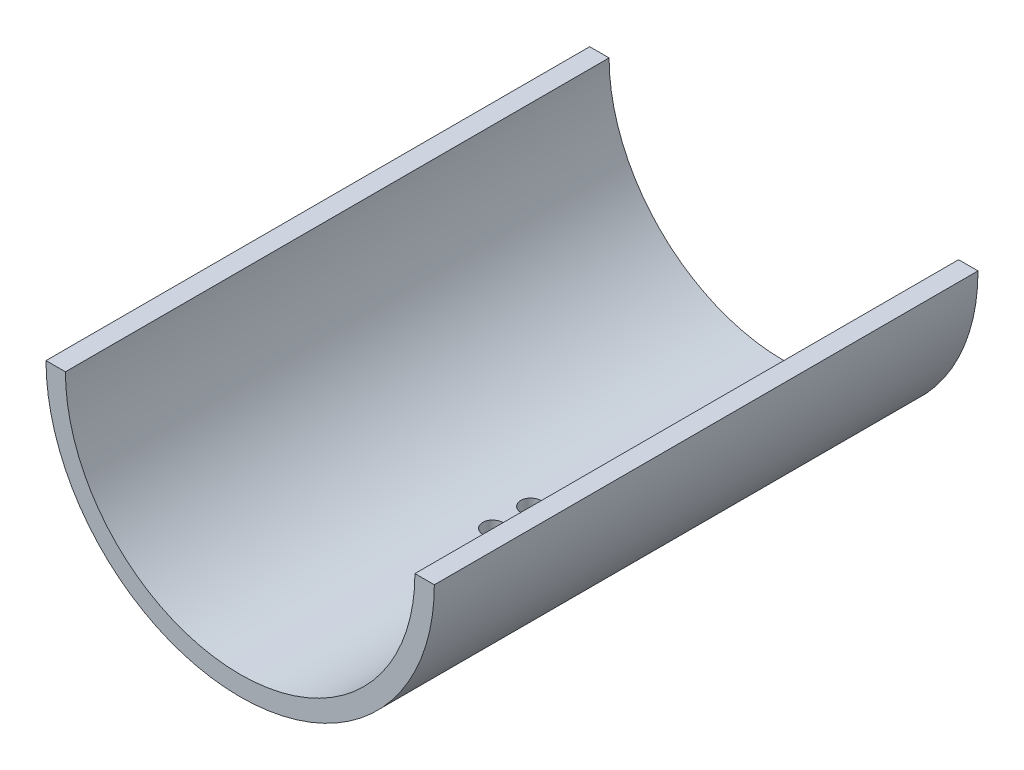
ISO-10303-21;
HEADER;
FILE_DESCRIPTION(('STEP AP214'),'2;1');
FILE_NAME('part.step','',(''),(''),'','','');
FILE_SCHEMA(('AUTOMOTIVE_DESIGN { 1 0 10303 214 1 1 1 1 }'));
ENDSEC;
DATA;
#1=APPLICATION_CONTEXT('core data for automotive mechanical design processes');
#2=APPLICATION_PROTOCOL_DEFINITION('international standard','automotive_design',2000,#1);
#3=PRODUCT_CONTEXT('',#1,'mechanical');
#4=PRODUCT('Part','Part','',(#3));
#5=PRODUCT_RELATED_PRODUCT_CATEGORY('part','',(#4));
#6=PRODUCT_DEFINITION_FORMATION('','',#4);
#7=PRODUCT_DEFINITION_CONTEXT('part definition',#1,'design');
#8=PRODUCT_DEFINITION('design','',#6,#7);
#9=PRODUCT_DEFINITION_SHAPE('','',#8);
#10=(LENGTH_UNIT() NAMED_UNIT(*) SI_UNIT(.MILLI.,.METRE.));
#11=(NAMED_UNIT(*) PLANE_ANGLE_UNIT() SI_UNIT($,.RADIAN.));
#12=(NAMED_UNIT(*) SI_UNIT($,.STERADIAN.) SOLID_ANGLE_UNIT());
#13=UNCERTAINTY_MEASURE_WITH_UNIT(LENGTH_MEASURE(1.E-05),#10,'distance_accuracy_value','');
#14=(GEOMETRIC_REPRESENTATION_CONTEXT(3) GLOBAL_UNCERTAINTY_ASSIGNED_CONTEXT((#13)) GLOBAL_UNIT_ASSIGNED_CONTEXT((#10,
#11,#12)) REPRESENTATION_CONTEXT('',''));
#15=CARTESIAN_POINT('',(0.,0.,0.));
#16=DIRECTION('',(0.,0.,1.));
#17=DIRECTION('',(1.,0.,0.));
#18=AXIS2_PLACEMENT_3D('',#15,#16,#17);
#19=CARTESIAN_POINT('',(63.5,4.43418130033078E-13,-149.431299240392));
#20=DIRECTION('',(0.,0.,1.));
#21=DIRECTION('',(1.,0.,0.));
#22=AXIS2_PLACEMENT_3D('',#19,#20,#21);
#23=PLANE('',#22);
#24=CARTESIAN_POINT('',(0.,0.,-149.431299240392));
#25=DIRECTION('',(0.,0.,-1.));
#26=DIRECTION('',(-1.,0.,0.));
#27=AXIS2_PLACEMENT_3D('',#24,#25,#26);
#28=CIRCLE('',#27,63.5);
#29=CARTESIAN_POINT('',(63.5,4.43418130033078E-13,-149.431299240392));
#30=VERTEX_POINT('',#29);
#31=CARTESIAN_POINT('',(-63.5,0.,-149.431299240392));
#32=VERTEX_POINT('',#31);
#33=EDGE_CURVE('E11',#30,#32,#28,.T.);
#34=ORIENTED_EDGE('',*,*,#33,.T.);
#35=DIRECTION('',(1.,0.,0.));
#36=VECTOR('',#35,1.);
#37=CARTESIAN_POINT('',(-63.5,0.,-149.431299240392));
#38=LINE('',#37,#36);
#39=CARTESIAN_POINT('',(-57.15,0.,-149.431299240392));
#40=VERTEX_POINT('',#39);
#41=EDGE_CURVE('E100',#32,#40,#38,.T.);
#42=ORIENTED_EDGE('',*,*,#41,.T.);
#43=CARTESIAN_POINT('',(0.,0.,-149.431299240392));
#44=DIRECTION('',(0.,0.,-1.));
#45=DIRECTION('',(-1.,0.,0.));
#46=AXIS2_PLACEMENT_3D('',#43,#44,#45);
#47=CIRCLE('',#46,57.15);
#48=CARTESIAN_POINT('',(57.15,3.9907631702977E-13,-149.431299240392));
#49=VERTEX_POINT('',#48);
#50=EDGE_CURVE('E82',#49,#40,#47,.T.);
#51=ORIENTED_EDGE('',*,*,#50,.F.);
#52=DIRECTION('',(-1.,0.,0.));
#53=VECTOR('',#52,1.);
#54=CARTESIAN_POINT('',(63.5,4.43418130033078E-13,-149.431299240392));
#55=LINE('',#54,#53);
#56=EDGE_CURVE('E116',#30,#49,#55,.T.);
#57=ORIENTED_EDGE('',*,*,#56,.F.);
#58=EDGE_LOOP('',(#34,#42,#51,#57));
#59=FACE_BOUND('',#58,.T.);
#60=ADVANCED_FACE('F35',(#59),#23,.F.);
#61=CARTESIAN_POINT('',(0.,0.,0.));
#62=DIRECTION('',(0.,0.,-1.));
#63=DIRECTION('',(-1.,0.,0.));
#64=AXIS2_PLACEMENT_3D('',#61,#62,#63);
#65=CYLINDRICAL_SURFACE('',#64,63.5);
#66=CARTESIAN_POINT('',(0.,-63.5,-50.9807992913919));
#67=CARTESIAN_POINT('',(0.186769612973574,-63.4999988348745,-50.9808075298809));
#68=CARTESIAN_POINT('',(0.373671384199386,-63.499167171897,-50.9965769279547));
#69=CARTESIAN_POINT('',(0.742318125547375,-63.4959294564745,-51.0592600732091));
#70=CARTESIAN_POINT('',(0.924056770398998,-63.4935215530255,-51.10621043763));
#71=CARTESIAN_POINT('',(1.2769837629213,-63.4874038671894,-51.2299068324632));
#72=CARTESIAN_POINT('',(1.44817746831194,-63.4836947524497,-51.3066375847931));
#73=CARTESIAN_POINT('',(1.77520888061647,-63.4753922812404,-51.4876929455275));
#74=CARTESIAN_POINT('',(1.93105018177016,-63.4707991324845,-51.5920110741201));
#75=CARTESIAN_POINT('',(2.22316985270653,-63.4612395969032,-51.8254067427574));
#76=CARTESIAN_POINT('',(2.35942929526198,-63.4562728559437,-51.9545079596415));
#77=CARTESIAN_POINT('',(2.60835592417208,-63.4465289652106,-52.2337574650064));
#78=CARTESIAN_POINT('',(2.72102214298066,-63.4417518232187,-52.383906616231));
#79=CARTESIAN_POINT('',(2.91961776346526,-63.4329232758394,-52.701090938846));
#80=CARTESIAN_POINT('',(3.00553216500733,-63.4288722781499,-52.868135514457));
#81=CARTESIAN_POINT('',(3.14808918437568,-63.4219572198435,-53.2143027640495));
#82=CARTESIAN_POINT('',(3.20473204049849,-63.419093149564,-53.3934253396918));
#83=CARTESIAN_POINT('',(3.28708748951324,-63.4148781639503,-53.7584878976584));
#84=CARTESIAN_POINT('',(3.3128287160745,-63.4135258478939,-53.9444214040043));
#85=CARTESIAN_POINT('',(3.33273856154113,-63.4124826662,-54.3179748731268));
#86=CARTESIAN_POINT('',(3.32690744854904,-63.412791786454,-54.5055948215691));
#87=CARTESIAN_POINT('',(3.28386197166952,-63.4150353166452,-54.8770006227596));
#88=CARTESIAN_POINT('',(3.24667855317205,-63.4169681239618,-55.0607900730632));
#89=CARTESIAN_POINT('',(3.14203192930411,-63.4222386632954,-55.4195149332989));
#90=CARTESIAN_POINT('',(3.07456858660398,-63.4255764016843,-55.5944503030707));
#91=CARTESIAN_POINT('',(2.91124184674428,-63.4332824668411,-55.9306008775589));
#92=CARTESIAN_POINT('',(2.8153643536022,-63.437651304908,-56.091809221212));
#93=CARTESIAN_POINT('',(2.59794118134746,-63.4469266516682,-56.3958545945505));
#94=CARTESIAN_POINT('',(2.47639530228522,-63.4518331645497,-56.5386914811134));
#95=CARTESIAN_POINT('',(2.21091102916137,-63.4616379852014,-56.8021194258162));
#96=CARTESIAN_POINT('',(2.06694584035849,-63.4665362759707,-56.9226834823425));
#97=CARTESIAN_POINT('',(1.76080371764046,-63.4757668910125,-57.1379352926375));
#98=CARTESIAN_POINT('',(1.59862677895295,-63.4800992151367,-57.2326230396252));
#99=CARTESIAN_POINT('',(1.26064886649794,-63.4877098656738,-57.3934318579842));
#100=CARTESIAN_POINT('',(1.0848474368834,-63.4909881568022,-57.4595519730549));
#101=CARTESIAN_POINT('',(0.724617959922059,-63.4961207754913,-57.5613309033625));
#102=CARTESIAN_POINT('',(0.540189983490808,-63.4979751147557,-57.5969899689616));
#103=CARTESIAN_POINT('',(0.168177031972474,-63.5000493432645,-57.6368012597076));
#104=CARTESIAN_POINT('',(-0.0194039362495373,-63.5002711698317,-57.6409908302105));
#105=CARTESIAN_POINT('',(-0.39260418007826,-63.4990605186156,-57.6178416839737));
#106=CARTESIAN_POINT('',(-0.578223462819968,-63.4976280468513,-57.5905030819473));
#107=CARTESIAN_POINT('',(-0.942126540985848,-63.493271374542,-57.505104545192));
#108=CARTESIAN_POINT('',(-1.12041435216575,-63.4903480027113,-57.4470616767101));
#109=CARTESIAN_POINT('',(-1.46471729689384,-63.4833386192235,-57.3019195383311));
#110=CARTESIAN_POINT('',(-1.63073235279255,-63.4792526002111,-57.2148200846128));
#111=CARTESIAN_POINT('',(-1.94594862558864,-63.4703726582839,-57.0139416913865));
#112=CARTESIAN_POINT('',(-2.09513388036065,-63.4655780731234,-56.9001377339812));
#113=CARTESIAN_POINT('',(-2.37229520082514,-63.4558231066146,-56.6491173380283));
#114=CARTESIAN_POINT('',(-2.50027111776843,-63.4508627241038,-56.5119007352927));
#115=CARTESIAN_POINT('',(-2.73150686182854,-63.4413297042126,-56.2177893864331));
#116=CARTESIAN_POINT('',(-2.83474251486356,-63.4367574488707,-56.0608756201419));
#117=CARTESIAN_POINT('',(-3.01340200607156,-63.4285222997772,-55.7319201631785));
#118=CARTESIAN_POINT('',(-3.08882597416744,-63.4248594017776,-55.559878543181));
#119=CARTESIAN_POINT('',(-3.20967898520769,-63.4188587526931,-55.2056403476141));
#120=CARTESIAN_POINT('',(-3.25512340475641,-63.4165203223717,-55.0234490299406));
#121=CARTESIAN_POINT('',(-3.31477759721792,-63.4134304025298,-54.6540096992474));
#122=CARTESIAN_POINT('',(-3.3289875705976,-63.4126789028241,-54.4667617186899));
#123=CARTESIAN_POINT('',(-3.32576760874424,-63.4128478396504,-54.0927649206231));
#124=CARTESIAN_POINT('',(-3.30837569804744,-63.4137662668665,-53.906015773635));
#125=CARTESIAN_POINT('',(-3.24252430425143,-63.4171672990711,-53.5380927062273));
#126=CARTESIAN_POINT('',(-3.19406476239714,-63.4196499070177,-53.3569187963524));
#127=CARTESIAN_POINT('',(-3.06746162862366,-63.4258990383602,-53.0052815614424));
#128=CARTESIAN_POINT('',(-2.98931788161838,-63.4296655684641,-52.8348182923709));
#129=CARTESIAN_POINT('',(-2.80557079140465,-63.4380579286002,-52.509427990118));
#130=CARTESIAN_POINT('',(-2.69996826770233,-63.4426837329862,-52.3545004934634));
#131=CARTESIAN_POINT('',(-2.46416401229021,-63.4522796726816,-52.0643889118328));
#132=CARTESIAN_POINT('',(-2.33393552985312,-63.4572501786806,-51.9292265832082));
#133=CARTESIAN_POINT('',(-2.05259829010835,-63.4669725726373,-51.6826396681636));
#134=CARTESIAN_POINT('',(-1.90148440888299,-63.4717244065646,-51.571220923977));
#135=CARTESIAN_POINT('',(-1.58253805541253,-63.4804775729998,-51.3752266614078));
#136=CARTESIAN_POINT('',(-1.41468890871421,-63.4844781453014,-51.2906782740593));
#137=CARTESIAN_POINT('',(-1.06728171777258,-63.4912668696877,-51.1510642902));
#138=CARTESIAN_POINT('',(-0.88773776521848,-63.4940564509796,-51.0959639213901));
#139=CARTESIAN_POINT('',(-0.589234376711043,-63.4973722175876,-51.0312399840445));
#140=CARTESIAN_POINT('',(-0.47220772872193,-63.4983532968073,-51.0123489273422));
#141=CARTESIAN_POINT('',(-0.236805098713705,-63.4996675571064,-50.9871259749589));
#142=CARTESIAN_POINT('',(-0.118429117967398,-63.5000007387968,-50.980794067432));
#143=CARTESIAN_POINT('',(0.,-63.5,-50.9807992913919));
#144=B_SPLINE_CURVE_WITH_KNOTS('',3,(#66,#67,#68,#69,#70,#71,#72,#73,#74,#75,#76,#77,#78,#79,
#80,#81,#82,#83,#84,#85,#86,#87,#88,#89,#90,#91,#92,#93,#94,#95,#96,#97,#98,#99,#100,#101,#102,
#103,#104,#105,#106,#107,#108,#109,#110,#111,#112,#113,#114,#115,#116,#117,#118,#119,#120,#121,
#122,#123,#124,#125,#126,#127,#128,#129,#130,#131,#132,#133,#134,#135,#136,#137,#138,#139,#140,
#141,#142,#143),.UNSPECIFIED.,.T.,.F.,(4,2,2,2,2,2,2,2,2,2,2,2,2,2,2,2,2,2,2,2,2,2,2,2,2,2,2,2,
2,2,2,2,2,2,2,2,2,2,4),(0.,0.559876523927777,1.12041170192468,1.68065969069416,2.24077620330726,
2.80143051772467,3.36210781978875,3.92309893801324,4.48408548919694,5.04455182403726,
5.60501339957823,6.16492243434914,6.72483400852167,7.28502381565576,7.8452179866736,
8.40608689378072,8.96695594786367,9.52784377556356,10.0887269932286,10.6489444964421,
11.2091599613443,11.7690643702796,12.3289723214159,12.8894069268809,13.4498454627216,
14.0108293988221,14.5718107142401,15.1325040764159,15.6931938399755,16.2532094079097,
16.8132260349477,17.3732455878512,17.9332484289108,18.4938631221405,19.0546155986857,
19.615932482031,20.1765850882347,20.5315986495085,20.8866118759309),.UNSPECIFIED.);
#145=CARTESIAN_POINT('',(0.,-63.5,-50.9807992913919));
#146=VERTEX_POINT('',#145);
#147=EDGE_CURVE('E126',#146,#146,#144,.T.);
#148=ORIENTED_EDGE('',*,*,#147,.T.);
#149=EDGE_LOOP('',(#148));
#150=FACE_BOUND('',#149,.T.);
#151=CARTESIAN_POINT('',(0.,-63.5,-63.4267992913919));
#152=CARTESIAN_POINT('',(0.186769612973574,-63.4999988348745,-63.4268075298809));
#153=CARTESIAN_POINT('',(0.373671384199388,-63.499167171897,-63.4425769279547));
#154=CARTESIAN_POINT('',(0.742318125547376,-63.4959294564745,-63.5052600732091));
#155=CARTESIAN_POINT('',(0.924056770398999,-63.4935215530255,-63.55221043763));
#156=CARTESIAN_POINT('',(1.2769837629213,-63.4874038671894,-63.6759068324632));
#157=CARTESIAN_POINT('',(1.44817746831194,-63.4836947524497,-63.7526375847931));
#158=CARTESIAN_POINT('',(1.77520888061647,-63.4753922812404,-63.9336929455275));
#159=CARTESIAN_POINT('',(1.93105018177016,-63.4707991324845,-64.0380110741201));
#160=CARTESIAN_POINT('',(2.22316985270653,-63.4612395969032,-64.2714067427574));
#161=CARTESIAN_POINT('',(2.35942929526198,-63.4562728559437,-64.4005079596415));
#162=CARTESIAN_POINT('',(2.60835592417208,-63.4465289652106,-64.6797574650065));
#163=CARTESIAN_POINT('',(2.72102214298066,-63.4417518232187,-64.829906616231));
#164=CARTESIAN_POINT('',(2.91961776346526,-63.4329232758394,-65.147090938846));
#165=CARTESIAN_POINT('',(3.00553216500733,-63.4288722781499,-65.314135514457));
#166=CARTESIAN_POINT('',(3.14808918437568,-63.4219572198435,-65.6603027640495));
#167=CARTESIAN_POINT('',(3.20473204049849,-63.419093149564,-65.8394253396918));
#168=CARTESIAN_POINT('',(3.28708748951324,-63.4148781639503,-66.2044878976584));
#169=CARTESIAN_POINT('',(3.3128287160745,-63.4135258478939,-66.3904214040043));
#170=CARTESIAN_POINT('',(3.33273856154112,-63.4124826662,-66.7639748731268));
#171=CARTESIAN_POINT('',(3.32690744854903,-63.412791786454,-66.9515948215691));
#172=CARTESIAN_POINT('',(3.28386197166952,-63.4150353166452,-67.3230006227596));
#173=CARTESIAN_POINT('',(3.24667855317205,-63.4169681239618,-67.5067900730632));
#174=CARTESIAN_POINT('',(3.1420319293041,-63.4222386632954,-67.8655149332989));
#175=CARTESIAN_POINT('',(3.07456858660398,-63.4255764016843,-68.0404503030707));
#176=CARTESIAN_POINT('',(2.91124184674428,-63.4332824668411,-68.3766008775589));
#177=CARTESIAN_POINT('',(2.81536435360219,-63.437651304908,-68.537809221212));
#178=CARTESIAN_POINT('',(2.59794118134745,-63.4469266516682,-68.8418545945505));
#179=CARTESIAN_POINT('',(2.4763953022852,-63.4518331645497,-68.9846914811134));
#180=CARTESIAN_POINT('',(2.21091102916136,-63.4616379852014,-69.2481194258162));
#181=CARTESIAN_POINT('',(2.06694584035848,-63.4665362759707,-69.3686834823425));
#182=CARTESIAN_POINT('',(1.76080371764046,-63.4757668910125,-69.5839352926374));
#183=CARTESIAN_POINT('',(1.59862677895294,-63.4800992151367,-69.6786230396252));
#184=CARTESIAN_POINT('',(1.26064886649794,-63.4877098656738,-69.8394318579842));
#185=CARTESIAN_POINT('',(1.0848474368834,-63.4909881568022,-69.9055519730549));
#186=CARTESIAN_POINT('',(0.724617959922055,-63.4961207754913,-70.0073309033625));
#187=CARTESIAN_POINT('',(0.540189983490803,-63.4979751147557,-70.0429899689615));
#188=CARTESIAN_POINT('',(0.168177031972469,-63.5000493432645,-70.0828012597076));
#189=CARTESIAN_POINT('',(-0.0194039362495408,-63.5002711698317,-70.0869908302105));
#190=CARTESIAN_POINT('',(-0.392604180078263,-63.4990605186156,-70.0638416839737));
#191=CARTESIAN_POINT('',(-0.57822346281997,-63.4976280468513,-70.0365030819473));
#192=CARTESIAN_POINT('',(-0.94212654098585,-63.493271374542,-69.951104545192));
#193=CARTESIAN_POINT('',(-1.12041435216575,-63.4903480027113,-69.8930616767101));
#194=CARTESIAN_POINT('',(-1.46471729689384,-63.4833386192235,-69.7479195383311));
#195=CARTESIAN_POINT('',(-1.63073235279255,-63.4792526002111,-69.6608200846128));
#196=CARTESIAN_POINT('',(-1.94594862558865,-63.4703726582839,-69.4599416913865));
#197=CARTESIAN_POINT('',(-2.09513388036066,-63.4655780731234,-69.3461377339812));
#198=CARTESIAN_POINT('',(-2.37229520082515,-63.4558231066146,-69.0951173380283));
#199=CARTESIAN_POINT('',(-2.50027111776843,-63.4508627241038,-68.9579007352927));
#200=CARTESIAN_POINT('',(-2.73150686182854,-63.4413297042126,-68.6637893864331));
#201=CARTESIAN_POINT('',(-2.83474251486356,-63.4367574488707,-68.5068756201419));
#202=CARTESIAN_POINT('',(-3.01340200607155,-63.4285222997772,-68.1779201631785));
#203=CARTESIAN_POINT('',(-3.08882597416744,-63.4248594017776,-68.005878543181));
#204=CARTESIAN_POINT('',(-3.20967898520769,-63.4188587526931,-67.6516403476141));
#205=CARTESIAN_POINT('',(-3.25512340475641,-63.4165203223717,-67.4694490299406));
#206=CARTESIAN_POINT('',(-3.31477759721792,-63.4134304025298,-67.1000096992474));
#207=CARTESIAN_POINT('',(-3.3289875705976,-63.4126789028241,-66.9127617186899));
#208=CARTESIAN_POINT('',(-3.32576760874423,-63.4128478396504,-66.5387649206231));
#209=CARTESIAN_POINT('',(-3.30837569804744,-63.4137662668665,-66.3520157736349));
#210=CARTESIAN_POINT('',(-3.24252430425142,-63.4171672990711,-65.9840927062273));
#211=CARTESIAN_POINT('',(-3.19406476239713,-63.4196499070177,-65.8029187963524));
#212=CARTESIAN_POINT('',(-3.06746162862366,-63.4258990383602,-65.4512815614424));
#213=CARTESIAN_POINT('',(-2.98931788161837,-63.4296655684641,-65.2808182923708));
#214=CARTESIAN_POINT('',(-2.80557079140464,-63.4380579286002,-64.955427990118));
#215=CARTESIAN_POINT('',(-2.69996826770231,-63.4426837329862,-64.8005004934634));
#216=CARTESIAN_POINT('',(-2.4641640122902,-63.4522796726816,-64.5103889118328));
#217=CARTESIAN_POINT('',(-2.33393552985311,-63.4572501786806,-64.3752265832082));
#218=CARTESIAN_POINT('',(-2.05259829010834,-63.4669725726373,-64.1286396681636));
#219=CARTESIAN_POINT('',(-1.90148440888299,-63.4717244065646,-64.017220923977));
#220=CARTESIAN_POINT('',(-1.58253805541253,-63.4804775729998,-63.8212266614078));
#221=CARTESIAN_POINT('',(-1.4146889087142,-63.4844781453014,-63.7366782740593));
#222=CARTESIAN_POINT('',(-1.06728171777256,-63.4912668696877,-63.5970642902));
#223=CARTESIAN_POINT('',(-0.887737765218469,-63.4940564509796,-63.5419639213901));
#224=CARTESIAN_POINT('',(-0.589234376711034,-63.4973722175876,-63.4772399840445));
#225=CARTESIAN_POINT('',(-0.472207728721921,-63.4983532968073,-63.4583489273422));
#226=CARTESIAN_POINT('',(-0.236805098713698,-63.4996675571064,-63.4331259749589));
#227=CARTESIAN_POINT('',(-0.118429117967395,-63.5000007387968,-63.426794067432));
#228=CARTESIAN_POINT('',(0.,-63.5,-63.4267992913919));
#229=B_SPLINE_CURVE_WITH_KNOTS('',3,(#151,#152,#153,#154,#155,#156,#157,#158,#159,#160,#161,
#162,#163,#164,#165,#166,#167,#168,#169,#170,#171,#172,#173,#174,#175,#176,#177,#178,#179,#180,
#181,#182,#183,#184,#185,#186,#187,#188,#189,#190,#191,#192,#193,#194,#195,#196,#197,#198,#199,
#200,#201,#202,#203,#204,#205,#206,#207,#208,#209,#210,#211,#212,#213,#214,#215,#216,#217,#218,
#219,#220,#221,#222,#223,#224,#225,#226,#227,#228),.UNSPECIFIED.,.T.,.F.,(4,2,2,2,2,2,2,2,2,2,2,
2,2,2,2,2,2,2,2,2,2,2,2,2,2,2,2,2,2,2,2,2,2,2,2,2,2,2,4),(0.,0.55987652392778,1.12041170192468,
1.68065969069416,2.24077620330726,2.80143051772468,3.36210781978875,3.92309893801325,
4.48408548919694,5.04455182403726,5.60501339957822,6.16492243434913,6.72483400852166,
7.28502381565576,7.84521798667359,8.40608689378071,8.96695594786365,9.52784377556355,
10.0887269932286,10.6489444964421,11.2091599613443,11.7690643702796,12.3289723214159,
12.8894069268809,13.4498454627216,14.010829398822,14.5718107142401,15.1325040764159,
15.6931938399755,16.2532094079097,16.8132260349477,17.3732455878512,17.9332484289108,
18.4938631221404,19.0546155986857,19.615932482031,20.1765850882347,20.5315986495085,
20.8866118759309),.UNSPECIFIED.);
#230=CARTESIAN_POINT('',(0.,-63.5,-63.4267992913919));
#231=VERTEX_POINT('',#230);
#232=EDGE_CURVE('E103',#231,#231,#229,.T.);
#233=ORIENTED_EDGE('',*,*,#232,.T.);
#234=EDGE_LOOP('',(#233));
#235=FACE_BOUND('',#234,.T.);
#236=CARTESIAN_POINT('',(0.,0.,28.3687007596081));
#237=DIRECTION('',(0.,0.,-1.));
#238=DIRECTION('',(-1.,0.,0.));
#239=AXIS2_PLACEMENT_3D('',#236,#237,#238);
#240=CIRCLE('',#239,63.5);
#241=CARTESIAN_POINT('',(63.5,4.43418130033078E-13,28.3687007596081));
#242=VERTEX_POINT('',#241);
#243=CARTESIAN_POINT('',(-63.5,0.,28.3687007596081));
#244=VERTEX_POINT('',#243);
#245=EDGE_CURVE('E49',#242,#244,#240,.T.);
#246=ORIENTED_EDGE('',*,*,#245,.T.);
#247=DIRECTION('',(0.,0.,-1.));
#248=VECTOR('',#247,1.);
#249=CARTESIAN_POINT('',(-63.5,0.,28.3687007596081));
#250=LINE('',#249,#248);
#251=EDGE_CURVE('E114',#244,#32,#250,.T.);
#252=ORIENTED_EDGE('',*,*,#251,.T.);
#253=ORIENTED_EDGE('',*,*,#33,.F.);
#254=DIRECTION('',(0.,0.,-1.));
#255=VECTOR('',#254,1.);
#256=CARTESIAN_POINT('',(63.5,4.43418130033078E-13,28.3687007596081));
#257=LINE('',#256,#255);
#258=EDGE_CURVE('E94',#242,#30,#257,.T.);
#259=ORIENTED_EDGE('',*,*,#258,.F.);
#260=EDGE_LOOP('',(#246,#252,#253,#259));
#261=FACE_BOUND('',#260,.T.);
#262=ADVANCED_FACE('F37',(#150,#235,#261),#65,.T.);
#263=CARTESIAN_POINT('',(63.5,4.43418130033078E-13,28.3687007596081));
#264=DIRECTION('',(0.,0.,-1.));
#265=DIRECTION('',(-1.,0.,0.));
#266=AXIS2_PLACEMENT_3D('',#263,#264,#265);
#267=PLANE('',#266);
#268=CARTESIAN_POINT('',(0.,0.,28.3687007596081));
#269=DIRECTION('',(0.,0.,-1.));
#270=DIRECTION('',(-1.,0.,0.));
#271=AXIS2_PLACEMENT_3D('',#268,#269,#270);
#272=CIRCLE('',#271,57.15);
#273=CARTESIAN_POINT('',(57.15,3.9907631702977E-13,28.3687007596081));
#274=VERTEX_POINT('',#273);
#275=CARTESIAN_POINT('',(-57.15,0.,28.3687007596081));
#276=VERTEX_POINT('',#275);
#277=EDGE_CURVE('E93',#274,#276,#272,.T.);
#278=ORIENTED_EDGE('',*,*,#277,.T.);
#279=DIRECTION('',(-1.,0.,0.));
#280=VECTOR('',#279,1.);
#281=CARTESIAN_POINT('',(-63.5,0.,28.3687007596081));
#282=LINE('',#281,#280);
#283=EDGE_CURVE('E101',#276,#244,#282,.T.);
#284=ORIENTED_EDGE('',*,*,#283,.T.);
#285=ORIENTED_EDGE('',*,*,#245,.F.);
#286=DIRECTION('',(1.,0.,0.));
#287=VECTOR('',#286,1.);
#288=CARTESIAN_POINT('',(63.5,4.43418130033078E-13,28.3687007596081));
#289=LINE('',#288,#287);
#290=EDGE_CURVE('E119',#274,#242,#289,.T.);
#291=ORIENTED_EDGE('',*,*,#290,.F.);
#292=EDGE_LOOP('',(#278,#284,#285,#291));
#293=FACE_BOUND('',#292,.T.);
#294=ADVANCED_FACE('F146',(#293),#267,.F.);
#295=CARTESIAN_POINT('',(0.,0.,0.));
#296=DIRECTION('',(0.,0.,-1.));
#297=DIRECTION('',(-1.,0.,0.));
#298=AXIS2_PLACEMENT_3D('',#295,#296,#297);
#299=CYLINDRICAL_SURFACE('',#298,57.15);
#300=CARTESIAN_POINT('',(0.,-57.15,-50.9807992913919));
#301=CARTESIAN_POINT('',(-0.186737397736102,-57.1499987091822,-50.9808075171684));
#302=CARTESIAN_POINT('',(-0.373606163322599,-57.1490749611724,-50.9965714977295));
#303=CARTESIAN_POINT('',(-0.742185594533203,-57.145478754157,-51.0592318688822));
#304=CARTESIAN_POINT('',(-0.923889970153505,-57.1428042506668,-51.1061646584917));
#305=CARTESIAN_POINT('',(-1.27674825866674,-57.1360091461716,-51.2298116354871));
#306=CARTESIAN_POINT('',(-1.44790761410133,-57.1318892986204,-51.3065103082116));
#307=CARTESIAN_POINT('',(-1.77487710419956,-57.1226671034869,-51.48748718153));
#308=CARTESIAN_POINT('',(-1.93069078229395,-57.1175649835264,-51.591758994693));
#309=CARTESIAN_POINT('',(-2.22279678426903,-57.1069443879398,-51.8250736529826));
#310=CARTESIAN_POINT('',(-2.35906624968253,-57.1014254361244,-51.9541450971742));
#311=CARTESIAN_POINT('',(-2.60802036170871,-57.090597274046,-52.2333367405944));
#312=CARTESIAN_POINT('',(-2.72070403099732,-57.0852880724817,-52.3834578116257));
#313=CARTESIAN_POINT('',(-2.91935616560733,-57.0754745433863,-52.700614004431));
#314=CARTESIAN_POINT('',(-3.00530597189818,-57.0709707789417,-52.8676608322918));
#315=CARTESIAN_POINT('',(-3.14793110050543,-57.0632820708122,-53.2138445193958));
#316=CARTESIAN_POINT('',(-3.20460670356321,-57.06009711448,-53.3929812626774));
#317=CARTESIAN_POINT('',(-3.28701205004692,-57.0554096579048,-53.7580423663256));
#318=CARTESIAN_POINT('',(-3.31277714301331,-57.0539052359235,-53.9439587221589));
#319=CARTESIAN_POINT('',(-3.33273919742333,-57.052742741432,-54.3174831574174));
#320=CARTESIAN_POINT('',(-3.32693647657659,-57.0530846503396,-54.5050912197978));
#321=CARTESIAN_POINT('',(-3.28395699083705,-57.0555744759021,-54.8764329144889));
#322=CARTESIAN_POINT('',(-3.24681845596538,-57.0577201918817,-55.0601709883865));
#323=CARTESIAN_POINT('',(-3.1422808476315,-57.0635723443425,-55.4188006373829));
#324=CARTESIAN_POINT('',(-3.07488161243206,-57.0672787891655,-55.5936921651931));
#325=CARTESIAN_POINT('',(-2.91169232378512,-57.0758372208145,-55.9297871459696));
#326=CARTESIAN_POINT('',(-2.81588489603294,-57.0806899083061,-56.0909821443623));
#327=CARTESIAN_POINT('',(-2.59861145586228,-57.0909932241063,-56.3950158890276));
#328=CARTESIAN_POINT('',(-2.47714519437464,-57.0964438582188,-56.5378544570935));
#329=CARTESIAN_POINT('',(-2.21178659633845,-57.1073385597692,-56.8013431365025));
#330=CARTESIAN_POINT('',(-2.06786116687703,-57.1127826053759,-56.9219599235025));
#331=CARTESIAN_POINT('',(-1.76178586542475,-57.1230427893963,-57.1373242224987));
#332=CARTESIAN_POINT('',(-1.59963598781744,-57.1278589276165,-57.2320717265224));
#333=CARTESIAN_POINT('',(-1.26169467944299,-57.1363208786981,-57.3930049688345));
#334=CARTESIAN_POINT('',(-1.08590266362827,-57.139966641333,-57.4591894813902));
#335=CARTESIAN_POINT('',(-0.725676055494288,-57.1456763001537,-57.5610959207554));
#336=CARTESIAN_POINT('',(-0.541241550822861,-57.147740212378,-57.5968181564279));
#337=CARTESIAN_POINT('',(-0.169254576588067,-57.1500515219821,-57.6367448073913));
#338=CARTESIAN_POINT('',(0.0182929311467864,-57.1503015752216,-57.6409953039244));
#339=CARTESIAN_POINT('',(0.3914363603753,-57.1489640475628,-57.6179781700416));
#340=CARTESIAN_POINT('',(0.577032290660586,-57.1473764749463,-57.5907106816719));
#341=CARTESIAN_POINT('',(0.940874617131349,-57.1425441594119,-57.5054697514713));
#342=CARTESIAN_POINT('',(1.11912597416634,-57.1393005555591,-57.4475174145319));
#343=CARTESIAN_POINT('',(1.4633722608839,-57.1315211920518,-57.3025732614336));
#344=CARTESIAN_POINT('',(1.62936709481011,-57.1269854223035,-57.2155812184257));
#345=CARTESIAN_POINT('',(1.94459958297207,-57.117124983035,-57.0149094839255));
#346=CARTESIAN_POINT('',(2.09381759000178,-57.1117994051522,-56.9011989741978));
#347=CARTESIAN_POINT('',(2.37106297630802,-57.1009618851337,-56.6503630496104));
#348=CARTESIAN_POINT('',(2.49909017369596,-57.0954499413988,-56.5132374337906));
#349=CARTESIAN_POINT('',(2.7304754674773,-57.0848532782142,-56.2192651877927));
#350=CARTESIAN_POINT('',(2.83380369809287,-57.0797690807551,-56.0623950289144));
#351=CARTESIAN_POINT('',(3.0126537236188,-57.0706095242081,-55.7335051454019));
#352=CARTESIAN_POINT('',(3.08817567157336,-57.0665341595676,-55.5614855041562));
#353=CARTESIAN_POINT('',(3.20921749061061,-57.0598555990206,-55.2072893210597));
#354=CARTESIAN_POINT('',(3.25475624777435,-57.0572514765419,-55.0251192514462));
#355=CARTESIAN_POINT('',(3.31460072017929,-57.0538064849239,-54.6557032048198));
#356=CARTESIAN_POINT('',(3.32890669660058,-57.0529656010398,-54.4684572702663));
#357=CARTESIAN_POINT('',(3.32587703615267,-57.0531422699867,-54.0945017802533));
#358=CARTESIAN_POINT('',(3.308588362127,-57.0541570645062,-53.9077918411944));
#359=CARTESIAN_POINT('',(3.24295742639661,-57.0579248892852,-53.5399305027558));
#360=CARTESIAN_POINT('',(3.19461510726646,-57.0606779227591,-53.3587791136558));
#361=CARTESIAN_POINT('',(3.06825939813788,-57.0676113088316,-53.0071691117719));
#362=CARTESIAN_POINT('',(2.99024604275361,-57.0717916597651,-52.8367104865143));
#363=CARTESIAN_POINT('',(2.80676969873787,-57.0811084722623,-52.5113054061582));
#364=CARTESIAN_POINT('',(2.70130746917592,-57.0862449073853,-52.356358522263));
#365=CARTESIAN_POINT('',(2.4657548996259,-57.0969038773446,-52.0661381250546));
#366=CARTESIAN_POINT('',(2.33563094165002,-57.1024269326498,-51.9308919173577));
#367=CARTESIAN_POINT('',(2.05448756228945,-57.1132324994144,-51.6841184993036));
#368=CARTESIAN_POINT('',(1.90346302612527,-57.1185149515717,-51.5725971118745));
#369=CARTESIAN_POINT('',(1.58465329568003,-57.1282488735788,-51.3763679786061));
#370=CARTESIAN_POINT('',(1.41684928802745,-57.1326993942505,-51.2916907844902));
#371=CARTESIAN_POINT('',(1.06950338060349,-57.1402547581133,-51.1518149392552));
#372=CARTESIAN_POINT('',(0.889975551003756,-57.1433611814452,-51.0965816556039));
#373=CARTESIAN_POINT('',(0.591119219089905,-57.1470614857448,-51.0315656509968));
#374=CARTESIAN_POINT('',(0.473723989503546,-57.148158551353,-51.0125527682562));
#375=CARTESIAN_POINT('',(0.237570232063864,-57.1496282186932,-50.9871669791108));
#376=CARTESIAN_POINT('',(0.118811705824876,-57.1500008212831,-50.9807940577401));
#377=CARTESIAN_POINT('',(0.,-57.15,-50.9807992913919));
#378=B_SPLINE_CURVE_WITH_KNOTS('',3,(#300,#301,#302,#303,#304,#305,#306,#307,#308,#309,#310,
#311,#312,#313,#314,#315,#316,#317,#318,#319,#320,#321,#322,#323,#324,#325,#326,#327,#328,#329,
#330,#331,#332,#333,#334,#335,#336,#337,#338,#339,#340,#341,#342,#343,#344,#345,#346,#347,#348,
#349,#350,#351,#352,#353,#354,#355,#356,#357,#358,#359,#360,#361,#362,#363,#364,#365,#366,#367,
#368,#369,#370,#371,#372,#373,#374,#375,#376,#377),.UNSPECIFIED.,.T.,.F.,(4,2,2,2,2,2,2,2,2,2,2,
2,2,2,2,2,2,2,2,2,2,2,2,2,2,2,2,2,2,2,2,2,2,2,2,2,2,2,4),(0.,0.559778469626776,1.12021180224884,
1.68035341562623,2.24036538340397,2.80102707866802,3.3617120014601,3.92278738343775,
4.48385738456865,5.0442851274283,5.6047072299558,6.16444659861484,6.72418895900125,
7.28427436354082,7.84436520505447,8.40528925503703,8.9662134778871,9.52716176946451,
10.0881043734134,10.6482254767448,11.2083440557149,11.7680778872935,12.3278160914344,
12.8882031189157,13.4485949561576,14.0096610248142,14.5707240053488,15.1314332395419,
15.6921377848586,16.2520095668897,16.8118823842571,17.3717545484801,17.9316112316769,
18.4922366533551,19.052999514425,19.6143983146018,20.1751353207947,20.5312949032554,
20.8874540640164),.UNSPECIFIED.);
#379=CARTESIAN_POINT('',(0.,-57.15,-50.9807992913919));
#380=VERTEX_POINT('',#379);
#381=EDGE_CURVE('E40',#380,#380,#378,.T.);
#382=ORIENTED_EDGE('',*,*,#381,.T.);
#383=EDGE_LOOP('',(#382));
#384=FACE_BOUND('',#383,.T.);
#385=CARTESIAN_POINT('',(0.,-57.15,-63.4267992913919));
#386=CARTESIAN_POINT('',(-0.186737397736102,-57.1499987091822,-63.4268075171684));
#387=CARTESIAN_POINT('',(-0.3736061633226,-57.1490749611724,-63.4425714977295));
#388=CARTESIAN_POINT('',(-0.742185594533204,-57.145478754157,-63.5052318688822));
#389=CARTESIAN_POINT('',(-0.923889970153505,-57.1428042506668,-63.5521646584917));
#390=CARTESIAN_POINT('',(-1.27674825866674,-57.1360091461716,-63.6758116354872));
#391=CARTESIAN_POINT('',(-1.44790761410132,-57.1318892986204,-63.7525103082116));
#392=CARTESIAN_POINT('',(-1.77487710419956,-57.1226671034869,-63.93348718153));
#393=CARTESIAN_POINT('',(-1.93069078229395,-57.1175649835264,-64.037758994693));
#394=CARTESIAN_POINT('',(-2.22279678426904,-57.1069443879398,-64.2710736529826));
#395=CARTESIAN_POINT('',(-2.35906624968253,-57.1014254361244,-64.4001450971742));
#396=CARTESIAN_POINT('',(-2.60802036170871,-57.090597274046,-64.6793367405944));
#397=CARTESIAN_POINT('',(-2.72070403099731,-57.0852880724817,-64.8294578116257));
#398=CARTESIAN_POINT('',(-2.91935616560733,-57.0754745433863,-65.146614004431));
#399=CARTESIAN_POINT('',(-3.00530597189818,-57.0709707789417,-65.3136608322918));
#400=CARTESIAN_POINT('',(-3.14793110050543,-57.0632820708122,-65.6598445193958));
#401=CARTESIAN_POINT('',(-3.20460670356321,-57.06009711448,-65.8389812626774));
#402=CARTESIAN_POINT('',(-3.28701205004691,-57.0554096579048,-66.2040423663256));
#403=CARTESIAN_POINT('',(-3.3127771430133,-57.0539052359235,-66.3899587221589));
#404=CARTESIAN_POINT('',(-3.33273919742333,-57.052742741432,-66.7634831574175));
#405=CARTESIAN_POINT('',(-3.32693647657658,-57.0530846503396,-66.9510912197978));
#406=CARTESIAN_POINT('',(-3.28395699083705,-57.0555744759021,-67.3224329144889));
#407=CARTESIAN_POINT('',(-3.24681845596538,-57.0577201918817,-67.5061709883865));
#408=CARTESIAN_POINT('',(-3.14228084763149,-57.0635723443426,-67.8648006373829));
#409=CARTESIAN_POINT('',(-3.07488161243206,-57.0672787891655,-68.0396921651931));
#410=CARTESIAN_POINT('',(-2.91169232378511,-57.0758372208145,-68.3757871459696));
#411=CARTESIAN_POINT('',(-2.81588489603293,-57.0806899083061,-68.5369821443623));
#412=CARTESIAN_POINT('',(-2.59861145586228,-57.0909932241063,-68.8410158890276));
#413=CARTESIAN_POINT('',(-2.47714519437464,-57.0964438582188,-68.9838544570935));
#414=CARTESIAN_POINT('',(-2.21178659633845,-57.1073385597692,-69.2473431365025));
#415=CARTESIAN_POINT('',(-2.06786116687703,-57.1127826053759,-69.3679599235025));
#416=CARTESIAN_POINT('',(-1.76178586542475,-57.1230427893963,-69.5833242224987));
#417=CARTESIAN_POINT('',(-1.59963598781743,-57.1278589276165,-69.6780717265224));
#418=CARTESIAN_POINT('',(-1.26169467944298,-57.1363208786981,-69.8390049688345));
#419=CARTESIAN_POINT('',(-1.08590266362826,-57.139966641333,-69.9051894813902));
#420=CARTESIAN_POINT('',(-0.725676055494284,-57.1456763001537,-70.0070959207554));
#421=CARTESIAN_POINT('',(-0.541241550822859,-57.147740212378,-70.0428181564278));
#422=CARTESIAN_POINT('',(-0.169254576588066,-57.1500515219821,-70.0827448073913));
#423=CARTESIAN_POINT('',(0.0182929311467885,-57.1503015752216,-70.0869953039244));
#424=CARTESIAN_POINT('',(0.391436360375303,-57.1489640475628,-70.0639781700416));
#425=CARTESIAN_POINT('',(0.577032290660589,-57.1473764749463,-70.0367106816719));
#426=CARTESIAN_POINT('',(0.940874617131352,-57.1425441594119,-69.9514697514713));
#427=CARTESIAN_POINT('',(1.11912597416634,-57.1393005555591,-69.8935174145319));
#428=CARTESIAN_POINT('',(1.4633722608839,-57.1315211920518,-69.7485732614335));
#429=CARTESIAN_POINT('',(1.6293670948101,-57.1269854223035,-69.6615812184257));
#430=CARTESIAN_POINT('',(1.94459958297207,-57.117124983035,-69.4609094839255));
#431=CARTESIAN_POINT('',(2.09381759000178,-57.1117994051522,-69.3471989741978));
#432=CARTESIAN_POINT('',(2.37106297630802,-57.1009618851337,-69.0963630496103));
#433=CARTESIAN_POINT('',(2.49909017369597,-57.0954499413988,-68.9592374337906));
#434=CARTESIAN_POINT('',(2.73047546747729,-57.0848532782142,-68.6652651877927));
#435=CARTESIAN_POINT('',(2.83380369809287,-57.0797690807551,-68.5083950289144));
#436=CARTESIAN_POINT('',(3.0126537236188,-57.0706095242081,-68.1795051454019));
#437=CARTESIAN_POINT('',(3.08817567157336,-57.0665341595676,-68.0074855041562));
#438=CARTESIAN_POINT('',(3.20921749061061,-57.0598555990206,-67.6532893210597));
#439=CARTESIAN_POINT('',(3.25475624777434,-57.0572514765419,-67.4711192514462));
#440=CARTESIAN_POINT('',(3.31460072017929,-57.0538064849239,-67.1017032048198));
#441=CARTESIAN_POINT('',(3.32890669660058,-57.0529656010398,-66.9144572702663));
#442=CARTESIAN_POINT('',(3.32587703615267,-57.0531422699867,-66.5405017802534));
#443=CARTESIAN_POINT('',(3.308588362127,-57.0541570645062,-66.3537918411944));
#444=CARTESIAN_POINT('',(3.24295742639661,-57.0579248892852,-65.9859305027558));
#445=CARTESIAN_POINT('',(3.19461510726646,-57.0606779227591,-65.8047791136558));
#446=CARTESIAN_POINT('',(3.06825939813787,-57.0676113088316,-65.4531691117719));
#447=CARTESIAN_POINT('',(2.9902460427536,-57.0717916597651,-65.2827104865142));
#448=CARTESIAN_POINT('',(2.80676969873786,-57.0811084722623,-64.9573054061581));
#449=CARTESIAN_POINT('',(2.70130746917591,-57.0862449073853,-64.802358522263));
#450=CARTESIAN_POINT('',(2.46575489962589,-57.0969038773446,-64.5121381250546));
#451=CARTESIAN_POINT('',(2.33563094165001,-57.1024269326498,-64.3768919173577));
#452=CARTESIAN_POINT('',(2.05448756228944,-57.1132324994144,-64.1301184993036));
#453=CARTESIAN_POINT('',(1.90346302612527,-57.1185149515717,-64.0185971118745));
#454=CARTESIAN_POINT('',(1.58465329568003,-57.1282488735788,-63.8223679786061));
#455=CARTESIAN_POINT('',(1.41684928802745,-57.1326993942505,-63.7376907844902));
#456=CARTESIAN_POINT('',(1.06950338060348,-57.1402547581133,-63.5978149392552));
#457=CARTESIAN_POINT('',(0.889975551003755,-57.1433611814452,-63.5425816556038));
#458=CARTESIAN_POINT('',(0.591119219089905,-57.1470614857448,-63.4775656509968));
#459=CARTESIAN_POINT('',(0.473723989503546,-57.148158551353,-63.4585527682562));
#460=CARTESIAN_POINT('',(0.237570232063864,-57.1496282186932,-63.4331669791108));
#461=CARTESIAN_POINT('',(0.118811705824876,-57.1500008212831,-63.4267940577401));
#462=CARTESIAN_POINT('',(0.,-57.15,-63.4267992913919));
#463=B_SPLINE_CURVE_WITH_KNOTS('',3,(#385,#386,#387,#388,#389,#390,#391,#392,#393,#394,#395,
#396,#397,#398,#399,#400,#401,#402,#403,#404,#405,#406,#407,#408,#409,#410,#411,#412,#413,#414,
#415,#416,#417,#418,#419,#420,#421,#422,#423,#424,#425,#426,#427,#428,#429,#430,#431,#432,#433,
#434,#435,#436,#437,#438,#439,#440,#441,#442,#443,#444,#445,#446,#447,#448,#449,#450,#451,#452,
#453,#454,#455,#456,#457,#458,#459,#460,#461,#462),.UNSPECIFIED.,.T.,.F.,(4,2,2,2,2,2,2,2,2,2,2,
2,2,2,2,2,2,2,2,2,2,2,2,2,2,2,2,2,2,2,2,2,2,2,2,2,2,2,4),(0.,0.559778469626777,1.12021180224884,
1.68035341562623,2.24036538340397,2.80102707866802,3.36171200146009,3.92278738343775,
4.48385738456865,5.04428512742829,5.6047072299558,6.16444659861483,6.72418895900123,
7.2842743635408,7.84436520505446,8.40528925503702,8.96621347788709,9.52716176946451,
10.0881043734133,10.6482254767448,11.2083440557149,11.7680778872935,12.3278160914344,
12.8882031189157,13.4485949561576,14.0096610248142,14.5707240053488,15.1314332395418,
15.6921377848586,16.2520095668897,16.811882384257,17.3717545484801,17.9316112316769,
18.4922366533551,19.052999514425,19.6143983146018,20.1751353207947,20.5312949032553,
20.8874540640164),.UNSPECIFIED.);
#464=CARTESIAN_POINT('',(0.,-57.15,-63.4267992913919));
#465=VERTEX_POINT('',#464);
#466=EDGE_CURVE('E106',#465,#465,#463,.T.);
#467=ORIENTED_EDGE('',*,*,#466,.T.);
#468=EDGE_LOOP('',(#467));
#469=FACE_BOUND('',#468,.T.);
#470=DIRECTION('',(0.,0.,1.));
#471=VECTOR('',#470,1.);
#472=CARTESIAN_POINT('',(57.15,3.9907631702977E-13,28.3687007596081));
#473=LINE('',#472,#471);
#474=EDGE_CURVE('E88',#49,#274,#473,.T.);
#475=ORIENTED_EDGE('',*,*,#474,.F.);
#476=ORIENTED_EDGE('',*,*,#50,.T.);
#477=DIRECTION('',(0.,0.,1.));
#478=VECTOR('',#477,1.);
#479=CARTESIAN_POINT('',(-57.15,0.,28.3687007596081));
#480=LINE('',#479,#478);
#481=EDGE_CURVE('E85',#40,#276,#480,.T.);
#482=ORIENTED_EDGE('',*,*,#481,.T.);
#483=ORIENTED_EDGE('',*,*,#277,.F.);
#484=EDGE_LOOP('',(#475,#476,#482,#483));
#485=FACE_BOUND('',#484,.T.);
#486=ADVANCED_FACE('F84',(#384,#469,#485),#299,.F.);
#487=CARTESIAN_POINT('',(0.,0.,0.));
#488=DIRECTION('',(0.,-1.,0.));
#489=DIRECTION('',(0.,0.,1.));
#490=AXIS2_PLACEMENT_3D('',#487,#488,#489);
#491=PLANE('',#490);
#492=ORIENTED_EDGE('',*,*,#56,.T.);
#493=ORIENTED_EDGE('',*,*,#474,.T.);
#494=ORIENTED_EDGE('',*,*,#290,.T.);
#495=ORIENTED_EDGE('',*,*,#258,.T.);
#496=EDGE_LOOP('',(#492,#493,#494,#495));
#497=FACE_BOUND('',#496,.T.);
#498=ADVANCED_FACE('F139',(#497),#491,.F.);
#499=CARTESIAN_POINT('',(0.,0.,0.));
#500=DIRECTION('',(0.,1.,0.));
#501=DIRECTION('',(0.,0.,1.));
#502=AXIS2_PLACEMENT_3D('',#499,#500,#501);
#503=PLANE('',#502);
#504=ORIENTED_EDGE('',*,*,#41,.F.);
#505=ORIENTED_EDGE('',*,*,#251,.F.);
#506=ORIENTED_EDGE('',*,*,#283,.F.);
#507=ORIENTED_EDGE('',*,*,#481,.F.);
#508=EDGE_LOOP('',(#504,#505,#506,#507));
#509=FACE_BOUND('',#508,.T.);
#510=ADVANCED_FACE('F98',(#509),#503,.T.);
#511=CARTESIAN_POINT('',(0.,-63.5,-66.7542992403919));
#512=DIRECTION('',(0.,1.,0.));
#513=DIRECTION('',(0.,0.,1.));
#514=AXIS2_PLACEMENT_3D('',#511,#512,#513);
#515=CYLINDRICAL_SURFACE('',#514,3.327499949);
#516=ORIENTED_EDGE('',*,*,#466,.F.);
#517=EDGE_LOOP('',(#516));
#518=FACE_BOUND('',#517,.T.);
#519=ORIENTED_EDGE('',*,*,#232,.F.);
#520=EDGE_LOOP('',(#519));
#521=FACE_BOUND('',#520,.T.);
#522=ADVANCED_FACE('F129',(#518,#521),#515,.F.);
#523=CARTESIAN_POINT('',(0.,-63.5,-54.3082992403919));
#524=DIRECTION('',(0.,1.,0.));
#525=DIRECTION('',(0.,0.,1.));
#526=AXIS2_PLACEMENT_3D('',#523,#524,#525);
#527=CYLINDRICAL_SURFACE('',#526,3.327499949);
#528=ORIENTED_EDGE('',*,*,#381,.F.);
#529=EDGE_LOOP('',(#528));
#530=FACE_BOUND('',#529,.T.);
#531=ORIENTED_EDGE('',*,*,#147,.F.);
#532=EDGE_LOOP('',(#531));
#533=FACE_BOUND('',#532,.T.);
#534=ADVANCED_FACE('F133',(#530,#533),#527,.F.);
#535=CLOSED_SHELL('',(#60,#262,#294,#486,#498,#510,#522,#534));
#536=MANIFOLD_SOLID_BREP('B2',#535);
#537=ADVANCED_BREP_SHAPE_REPRESENTATION('',(#18,#536),#14);
#538=SHAPE_DEFINITION_REPRESENTATION(#9,#537);
ENDSEC;
END-ISO-10303-21;
